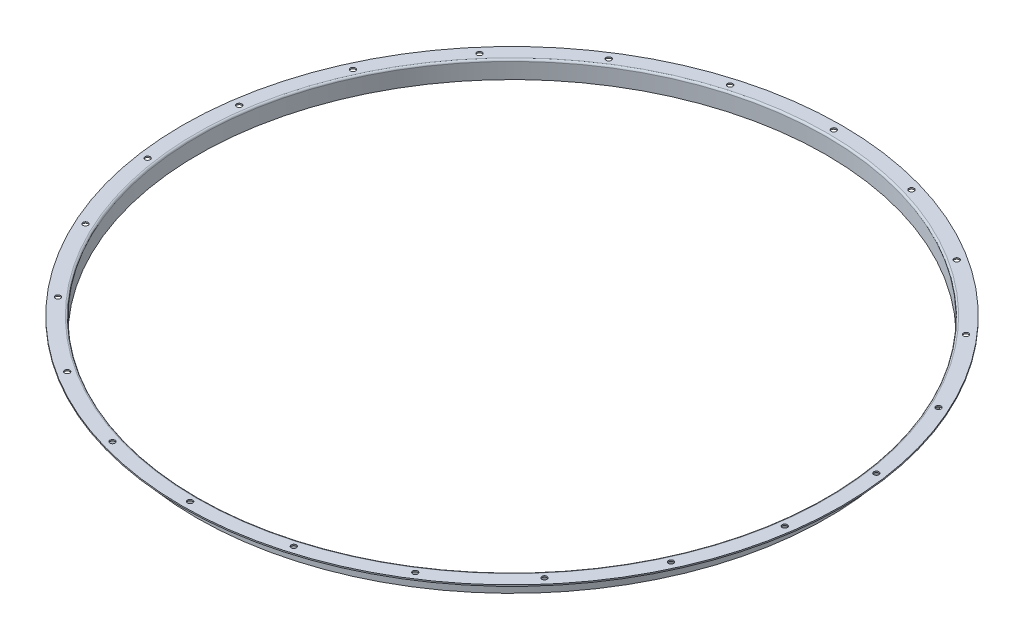
ISO-10303-21;
HEADER;
FILE_DESCRIPTION(('STEP AP214'),'2;1');
FILE_NAME('part.step','',(''),(''),'','','');
FILE_SCHEMA(('AUTOMOTIVE_DESIGN { 1 0 10303 214 1 1 1 1 }'));
ENDSEC;
DATA;
#1=APPLICATION_CONTEXT('core data for automotive mechanical design processes');
#2=APPLICATION_PROTOCOL_DEFINITION('international standard','automotive_design',2000,#1);
#3=PRODUCT_CONTEXT('',#1,'mechanical');
#4=PRODUCT('Part','Part','',(#3));
#5=PRODUCT_RELATED_PRODUCT_CATEGORY('part','',(#4));
#6=PRODUCT_DEFINITION_FORMATION('','',#4);
#7=PRODUCT_DEFINITION_CONTEXT('part definition',#1,'design');
#8=PRODUCT_DEFINITION('design','',#6,#7);
#9=PRODUCT_DEFINITION_SHAPE('','',#8);
#10=(LENGTH_UNIT() NAMED_UNIT(*) SI_UNIT(.MILLI.,.METRE.));
#11=(NAMED_UNIT(*) PLANE_ANGLE_UNIT() SI_UNIT($,.RADIAN.));
#12=(NAMED_UNIT(*) SI_UNIT($,.STERADIAN.) SOLID_ANGLE_UNIT());
#13=UNCERTAINTY_MEASURE_WITH_UNIT(LENGTH_MEASURE(1.E-05),#10,'distance_accuracy_value','');
#14=(GEOMETRIC_REPRESENTATION_CONTEXT(3) GLOBAL_UNCERTAINTY_ASSIGNED_CONTEXT((#13)) GLOBAL_UNIT_ASSIGNED_CONTEXT((#10,
#11,#12)) REPRESENTATION_CONTEXT('',''));
#15=CARTESIAN_POINT('',(0.,0.,0.));
#16=DIRECTION('',(0.,0.,1.));
#17=DIRECTION('',(1.,0.,0.));
#18=AXIS2_PLACEMENT_3D('',#15,#16,#17);
#19=CARTESIAN_POINT('',(0.,-2.5,0.));
#20=DIRECTION('',(0.,1.,0.));
#21=DIRECTION('',(0.,0.,1.));
#22=AXIS2_PLACEMENT_3D('',#19,#20,#21);
#23=PLANE('',#22);
#24=CARTESIAN_POINT('',(-559.423677142992,-2.5,255.480232996192));
#25=DIRECTION('',(0.,1.,0.));
#26=DIRECTION('',(0.,0.,1.));
#27=AXIS2_PLACEMENT_3D('',#24,#25,#26);
#28=CIRCLE('',#27,5.00000000006797);
#29=CARTESIAN_POINT('',(-559.423677142992,-2.5,260.48023299626));
#30=VERTEX_POINT('',#29);
#31=EDGE_CURVE('E139',#30,#30,#28,.T.);
#32=ORIENTED_EDGE('',*,*,#31,.T.);
#33=EDGE_LOOP('',(#32));
#34=FACE_BOUND('',#33,.T.);
#35=CARTESIAN_POINT('',(-464.785988227824,-2.5,402.739351376377));
#36=DIRECTION('',(0.,1.,0.));
#37=DIRECTION('',(0.,0.,1.));
#38=AXIS2_PLACEMENT_3D('',#35,#36,#37);
#39=CIRCLE('',#38,5.00000000006797);
#40=CARTESIAN_POINT('',(-464.785988227824,-2.5,407.739351376445));
#41=VERTEX_POINT('',#40);
#42=EDGE_CURVE('E335',#41,#41,#39,.T.);
#43=ORIENTED_EDGE('',*,*,#42,.T.);
#44=EDGE_LOOP('',(#43));
#45=FACE_BOUND('',#44,.T.);
#46=CARTESIAN_POINT('',(-332.494102735141,-2.5,517.370922691195));
#47=DIRECTION('',(0.,1.,0.));
#48=DIRECTION('',(0.,0.,1.));
#49=AXIS2_PLACEMENT_3D('',#46,#47,#48);
#50=CIRCLE('',#49,5.00000000006797);
#51=CARTESIAN_POINT('',(-332.494102735141,-2.5,522.370922691263));
#52=VERTEX_POINT('',#51);
#53=EDGE_CURVE('E333',#52,#52,#50,.T.);
#54=ORIENTED_EDGE('',*,*,#53,.T.);
#55=EDGE_LOOP('',(#54));
#56=FACE_BOUND('',#55,.T.);
#57=CARTESIAN_POINT('',(-173.265522457423,-2.5,590.088178772926));
#58=DIRECTION('',(0.,1.,0.));
#59=DIRECTION('',(0.,0.,1.));
#60=AXIS2_PLACEMENT_3D('',#57,#58,#59);
#61=CIRCLE('',#60,5.00000000006797);
#62=CARTESIAN_POINT('',(-173.265522457423,-2.5,595.088178772994));
#63=VERTEX_POINT('',#62);
#64=EDGE_CURVE('E330',#63,#63,#61,.T.);
#65=ORIENTED_EDGE('',*,*,#64,.T.);
#66=EDGE_LOOP('',(#65));
#67=FACE_BOUND('',#66,.T.);
#68=CARTESIAN_POINT('',(5.72449751156519E-11,-2.5,615.));
#69=DIRECTION('',(0.,1.,0.));
#70=DIRECTION('',(0.,0.,1.));
#71=AXIS2_PLACEMENT_3D('',#68,#69,#70);
#72=CIRCLE('',#71,5.00000000006795);
#73=CARTESIAN_POINT('',(5.72449751156519E-11,-2.5,620.000000000068));
#74=VERTEX_POINT('',#73);
#75=EDGE_CURVE('E327',#74,#74,#72,.T.);
#76=ORIENTED_EDGE('',*,*,#75,.T.);
#77=EDGE_LOOP('',(#76));
#78=FACE_BOUND('',#77,.T.);
#79=CARTESIAN_POINT('',(173.265522457535,-2.5,590.088178772906));
#80=DIRECTION('',(0.,1.,0.));
#81=DIRECTION('',(0.,0.,1.));
#82=AXIS2_PLACEMENT_3D('',#79,#80,#81);
#83=CIRCLE('',#82,5.00000000006797);
#84=CARTESIAN_POINT('',(173.265522457535,-2.5,595.088178772974));
#85=VERTEX_POINT('',#84);
#86=EDGE_CURVE('E324',#85,#85,#83,.T.);
#87=ORIENTED_EDGE('',*,*,#86,.T.);
#88=EDGE_LOOP('',(#87));
#89=FACE_BOUND('',#88,.T.);
#90=CARTESIAN_POINT('',(332.494102735244,-2.5,517.370922691157));
#91=DIRECTION('',(0.,1.,0.));
#92=DIRECTION('',(0.,0.,1.));
#93=AXIS2_PLACEMENT_3D('',#90,#91,#92);
#94=CIRCLE('',#93,5.00000000006797);
#95=CARTESIAN_POINT('',(332.494102735244,-2.5,522.370922691225));
#96=VERTEX_POINT('',#95);
#97=EDGE_CURVE('E321',#96,#96,#94,.T.);
#98=ORIENTED_EDGE('',*,*,#97,.T.);
#99=EDGE_LOOP('',(#98));
#100=FACE_BOUND('',#99,.T.);
#101=CARTESIAN_POINT('',(464.785988227914,-2.5,402.739351376324));
#102=DIRECTION('',(0.,1.,0.));
#103=DIRECTION('',(0.,0.,1.));
#104=AXIS2_PLACEMENT_3D('',#101,#102,#103);
#105=CIRCLE('',#104,5.00000000006797);
#106=CARTESIAN_POINT('',(464.785988227914,-2.5,407.739351376392));
#107=VERTEX_POINT('',#106);
#108=EDGE_CURVE('E318',#107,#107,#105,.T.);
#109=ORIENTED_EDGE('',*,*,#108,.T.);
#110=EDGE_LOOP('',(#109));
#111=FACE_BOUND('',#110,.T.);
#112=CARTESIAN_POINT('',(559.423677143066,-2.5,255.480232996128));
#113=DIRECTION('',(0.,1.,0.));
#114=DIRECTION('',(0.,0.,1.));
#115=AXIS2_PLACEMENT_3D('',#112,#113,#114);
#116=CIRCLE('',#115,5.00000000006797);
#117=CARTESIAN_POINT('',(559.423677143066,-2.5,260.480232996196));
#118=VERTEX_POINT('',#117);
#119=EDGE_CURVE('E315',#118,#118,#116,.T.);
#120=ORIENTED_EDGE('',*,*,#119,.T.);
#121=EDGE_LOOP('',(#120));
#122=FACE_BOUND('',#121,.T.);
#123=CARTESIAN_POINT('',(608.740186756801,-2.5,87.5236255380358));
#124=DIRECTION('',(0.,1.,0.));
#125=DIRECTION('',(0.,0.,1.));
#126=AXIS2_PLACEMENT_3D('',#123,#124,#125);
#127=CIRCLE('',#126,5.00000000006796);
#128=CARTESIAN_POINT('',(608.740186756801,-2.5,92.5236255381038));
#129=VERTEX_POINT('',#128);
#130=EDGE_CURVE('E312',#129,#129,#127,.T.);
#131=ORIENTED_EDGE('',*,*,#130,.T.);
#132=EDGE_LOOP('',(#131));
#133=FACE_BOUND('',#132,.T.);
#134=CARTESIAN_POINT('',(608.740186756791,-2.5,-87.5236255381049));
#135=DIRECTION('',(0.,1.,0.));
#136=DIRECTION('',(0.,0.,1.));
#137=AXIS2_PLACEMENT_3D('',#134,#135,#136);
#138=CIRCLE('',#137,5.00000000006796);
#139=CARTESIAN_POINT('',(608.740186756791,-2.5,-82.5236255380369));
#140=VERTEX_POINT('',#139);
#141=EDGE_CURVE('E309',#140,#140,#138,.T.);
#142=ORIENTED_EDGE('',*,*,#141,.T.);
#143=EDGE_LOOP('',(#142));
#144=FACE_BOUND('',#143,.T.);
#145=CARTESIAN_POINT('',(559.423677143037,-2.5,-255.480232996192));
#146=DIRECTION('',(0.,1.,0.));
#147=DIRECTION('',(0.,0.,1.));
#148=AXIS2_PLACEMENT_3D('',#145,#146,#147);
#149=CIRCLE('',#148,5.00000000006797);
#150=CARTESIAN_POINT('',(559.423677143037,-2.5,-250.480232996124));
#151=VERTEX_POINT('',#150);
#152=EDGE_CURVE('E306',#151,#151,#149,.T.);
#153=ORIENTED_EDGE('',*,*,#152,.T.);
#154=EDGE_LOOP('',(#153));
#155=FACE_BOUND('',#154,.T.);
#156=CARTESIAN_POINT('',(173.265522457468,-2.5,-590.088178772926));
#157=DIRECTION('',(0.,1.,0.));
#158=DIRECTION('',(0.,0.,1.));
#159=AXIS2_PLACEMENT_3D('',#156,#157,#158);
#160=CIRCLE('',#159,5.00000000006797);
#161=CARTESIAN_POINT('',(173.265522457468,-2.5,-585.088178772858));
#162=VERTEX_POINT('',#161);
#163=EDGE_CURVE('E303',#162,#162,#160,.T.);
#164=ORIENTED_EDGE('',*,*,#163,.T.);
#165=EDGE_LOOP('',(#164));
#166=FACE_BOUND('',#165,.T.);
#167=CARTESIAN_POINT('',(332.494102735185,-2.5,-517.370922691195));
#168=DIRECTION('',(0.,1.,0.));
#169=DIRECTION('',(0.,0.,1.));
#170=AXIS2_PLACEMENT_3D('',#167,#168,#169);
#171=CIRCLE('',#170,5.00000000006797);
#172=CARTESIAN_POINT('',(332.494102735185,-2.5,-512.370922691127));
#173=VERTEX_POINT('',#172);
#174=EDGE_CURVE('E300',#173,#173,#171,.T.);
#175=ORIENTED_EDGE('',*,*,#174,.T.);
#176=EDGE_LOOP('',(#175));
#177=FACE_BOUND('',#176,.T.);
#178=CARTESIAN_POINT('',(-1.25217985268468E-11,-2.5,-615.));
#179=DIRECTION('',(0.,1.,0.));
#180=DIRECTION('',(0.,0.,1.));
#181=AXIS2_PLACEMENT_3D('',#178,#179,#180);
#182=CIRCLE('',#181,5.00000000006795);
#183=CARTESIAN_POINT('',(-1.25217985268468E-11,-2.5,-609.999999999932));
#184=VERTEX_POINT('',#183);
#185=EDGE_CURVE('E291',#184,#184,#182,.T.);
#186=ORIENTED_EDGE('',*,*,#185,.T.);
#187=EDGE_LOOP('',(#186));
#188=FACE_BOUND('',#187,.T.);
#189=CARTESIAN_POINT('',(464.785988227868,-2.5,-402.739351376377));
#190=DIRECTION('',(0.,1.,0.));
#191=DIRECTION('',(0.,0.,1.));
#192=AXIS2_PLACEMENT_3D('',#189,#190,#191);
#193=CIRCLE('',#192,5.00000000006797);
#194=CARTESIAN_POINT('',(464.785988227868,-2.5,-397.739351376309));
#195=VERTEX_POINT('',#194);
#196=EDGE_CURVE('E287',#195,#195,#193,.T.);
#197=ORIENTED_EDGE('',*,*,#196,.T.);
#198=EDGE_LOOP('',(#197));
#199=FACE_BOUND('',#198,.T.);
#200=CARTESIAN_POINT('',(-608.740186756756,-2.5,-87.5236255380357));
#201=DIRECTION('',(0.,1.,0.));
#202=DIRECTION('',(0.,0.,1.));
#203=AXIS2_PLACEMENT_3D('',#200,#201,#202);
#204=CIRCLE('',#203,5.00000000006843);
#205=CARTESIAN_POINT('',(-608.740186756756,-2.5,-82.5236255379673));
#206=VERTEX_POINT('',#205);
#207=EDGE_CURVE('E285',#206,#206,#204,.T.);
#208=ORIENTED_EDGE('',*,*,#207,.T.);
#209=EDGE_LOOP('',(#208));
#210=FACE_BOUND('',#209,.T.);
#211=CARTESIAN_POINT('',(-559.423677143021,-2.5,-255.480232996128));
#212=DIRECTION('',(0.,1.,0.));
#213=DIRECTION('',(0.,0.,1.));
#214=AXIS2_PLACEMENT_3D('',#211,#212,#213);
#215=CIRCLE('',#214,5.00000000007028);
#216=CARTESIAN_POINT('',(-559.423677143021,-2.5,-250.480232996058));
#217=VERTEX_POINT('',#216);
#218=EDGE_CURVE('E288',#217,#217,#215,.T.);
#219=ORIENTED_EDGE('',*,*,#218,.T.);
#220=EDGE_LOOP('',(#219));
#221=FACE_BOUND('',#220,.T.);
#222=CARTESIAN_POINT('',(-464.785988227869,-2.5,-402.739351376324));
#223=DIRECTION('',(0.,1.,0.));
#224=DIRECTION('',(0.,0.,1.));
#225=AXIS2_PLACEMENT_3D('',#222,#223,#224);
#226=CIRCLE('',#225,5.00000000006797);
#227=CARTESIAN_POINT('',(-464.785988227869,-2.5,-397.739351376256));
#228=VERTEX_POINT('',#227);
#229=EDGE_CURVE('E294',#228,#228,#226,.T.);
#230=ORIENTED_EDGE('',*,*,#229,.T.);
#231=EDGE_LOOP('',(#230));
#232=FACE_BOUND('',#231,.T.);
#233=CARTESIAN_POINT('',(-332.494102735199,-2.5,-517.370922691158));
#234=DIRECTION('',(0.,1.,0.));
#235=DIRECTION('',(0.,0.,1.));
#236=AXIS2_PLACEMENT_3D('',#233,#234,#235);
#237=CIRCLE('',#236,5.00000000006797);
#238=CARTESIAN_POINT('',(-332.494102735199,-2.5,-512.37092269109));
#239=VERTEX_POINT('',#238);
#240=EDGE_CURVE('E378',#239,#239,#237,.T.);
#241=ORIENTED_EDGE('',*,*,#240,.T.);
#242=EDGE_LOOP('',(#241));
#243=FACE_BOUND('',#242,.T.);
#244=CARTESIAN_POINT('',(-173.26552245749,-2.5,-590.088178772906));
#245=DIRECTION('',(0.,1.,0.));
#246=DIRECTION('',(0.,0.,1.));
#247=AXIS2_PLACEMENT_3D('',#244,#245,#246);
#248=CIRCLE('',#247,5.00000000006797);
#249=CARTESIAN_POINT('',(-173.26552245749,-2.5,-585.088178772838));
#250=VERTEX_POINT('',#249);
#251=EDGE_CURVE('E382',#250,#250,#248,.T.);
#252=ORIENTED_EDGE('',*,*,#251,.T.);
#253=EDGE_LOOP('',(#252));
#254=FACE_BOUND('',#253,.T.);
#255=CARTESIAN_POINT('',(-608.740186756746,-2.5,87.5236255381049));
#256=DIRECTION('',(0.,1.,0.));
#257=DIRECTION('',(0.,0.,1.));
#258=AXIS2_PLACEMENT_3D('',#255,#256,#257);
#259=CIRCLE('',#258,5.00000000006796);
#260=CARTESIAN_POINT('',(-608.740186756746,-2.5,92.5236255381729));
#261=VERTEX_POINT('',#260);
#262=EDGE_CURVE('E386',#261,#261,#259,.T.);
#263=ORIENTED_EDGE('',*,*,#262,.T.);
#264=EDGE_LOOP('',(#263));
#265=FACE_BOUND('',#264,.T.);
#266=CARTESIAN_POINT('',(0.,-2.5,0.));
#267=DIRECTION('',(0.,1.,0.));
#268=DIRECTION('',(0.,0.,1.));
#269=AXIS2_PLACEMENT_3D('',#266,#267,#268);
#270=CIRCLE('',#269,630.);
#271=CARTESIAN_POINT('',(0.,-2.5,630.));
#272=VERTEX_POINT('',#271);
#273=EDGE_CURVE('E96',#272,#272,#270,.T.);
#274=ORIENTED_EDGE('',*,*,#273,.F.);
#275=EDGE_LOOP('',(#274));
#276=FACE_BOUND('',#275,.T.);
#277=CARTESIAN_POINT('',(0.,-2.5,0.));
#278=DIRECTION('',(0.,1.,0.));
#279=DIRECTION('',(0.,0.,1.));
#280=AXIS2_PLACEMENT_3D('',#277,#278,#279);
#281=CIRCLE('',#280,603.5);
#282=CARTESIAN_POINT('',(0.,-2.5,603.5));
#283=VERTEX_POINT('',#282);
#284=EDGE_CURVE('E12',#283,#283,#281,.F.);
#285=ORIENTED_EDGE('',*,*,#284,.F.);
#286=EDGE_LOOP('',(#285));
#287=FACE_BOUND('',#286,.T.);
#288=ADVANCED_FACE('F88',(#34,#45,#56,#67,#78,#89,#100,#111,#122,#133,#144,#155,#166,#177,#188,
#199,#210,#221,#232,#243,#254,#265,#276,#287),#23,.F.);
#289=CARTESIAN_POINT('',(0.,0.,0.));
#290=DIRECTION('',(0.,1.,0.));
#291=DIRECTION('',(0.,0.,1.));
#292=AXIS2_PLACEMENT_3D('',#289,#290,#291);
#293=PLANE('',#292);
#294=CARTESIAN_POINT('',(-559.423677142992,0.,255.480232996192));
#295=DIRECTION('',(0.,1.,0.));
#296=DIRECTION('',(0.,0.,1.));
#297=AXIS2_PLACEMENT_3D('',#294,#295,#296);
#298=CIRCLE('',#297,5.00000000006797);
#299=CARTESIAN_POINT('',(-559.423677142992,0.,260.48023299626));
#300=VERTEX_POINT('',#299);
#301=EDGE_CURVE('E421',#300,#300,#298,.T.);
#302=ORIENTED_EDGE('',*,*,#301,.F.);
#303=EDGE_LOOP('',(#302));
#304=FACE_BOUND('',#303,.T.);
#305=CARTESIAN_POINT('',(-464.785988227824,0.,402.739351376377));
#306=DIRECTION('',(0.,1.,0.));
#307=DIRECTION('',(0.,0.,1.));
#308=AXIS2_PLACEMENT_3D('',#305,#306,#307);
#309=CIRCLE('',#308,5.00000000006797);
#310=CARTESIAN_POINT('',(-464.785988227824,0.,407.739351376445));
#311=VERTEX_POINT('',#310);
#312=EDGE_CURVE('E424',#311,#311,#309,.T.);
#313=ORIENTED_EDGE('',*,*,#312,.F.);
#314=EDGE_LOOP('',(#313));
#315=FACE_BOUND('',#314,.T.);
#316=CARTESIAN_POINT('',(-332.494102735141,0.,517.370922691195));
#317=DIRECTION('',(0.,1.,0.));
#318=DIRECTION('',(0.,0.,1.));
#319=AXIS2_PLACEMENT_3D('',#316,#317,#318);
#320=CIRCLE('',#319,5.00000000006797);
#321=CARTESIAN_POINT('',(-332.494102735141,0.,522.370922691263));
#322=VERTEX_POINT('',#321);
#323=EDGE_CURVE('E427',#322,#322,#320,.T.);
#324=ORIENTED_EDGE('',*,*,#323,.F.);
#325=EDGE_LOOP('',(#324));
#326=FACE_BOUND('',#325,.T.);
#327=CARTESIAN_POINT('',(-173.265522457423,0.,590.088178772926));
#328=DIRECTION('',(0.,1.,0.));
#329=DIRECTION('',(0.,0.,1.));
#330=AXIS2_PLACEMENT_3D('',#327,#328,#329);
#331=CIRCLE('',#330,5.00000000006797);
#332=CARTESIAN_POINT('',(-173.265522457423,0.,595.088178772994));
#333=VERTEX_POINT('',#332);
#334=EDGE_CURVE('E430',#333,#333,#331,.T.);
#335=ORIENTED_EDGE('',*,*,#334,.F.);
#336=EDGE_LOOP('',(#335));
#337=FACE_BOUND('',#336,.T.);
#338=CARTESIAN_POINT('',(5.72449751156519E-11,0.,615.));
#339=DIRECTION('',(0.,1.,0.));
#340=DIRECTION('',(0.,0.,1.));
#341=AXIS2_PLACEMENT_3D('',#338,#339,#340);
#342=CIRCLE('',#341,5.00000000006795);
#343=CARTESIAN_POINT('',(5.72449751156519E-11,0.,620.000000000068));
#344=VERTEX_POINT('',#343);
#345=EDGE_CURVE('E433',#344,#344,#342,.T.);
#346=ORIENTED_EDGE('',*,*,#345,.F.);
#347=EDGE_LOOP('',(#346));
#348=FACE_BOUND('',#347,.T.);
#349=CARTESIAN_POINT('',(173.265522457535,0.,590.088178772906));
#350=DIRECTION('',(0.,1.,0.));
#351=DIRECTION('',(0.,0.,1.));
#352=AXIS2_PLACEMENT_3D('',#349,#350,#351);
#353=CIRCLE('',#352,5.00000000006797);
#354=CARTESIAN_POINT('',(173.265522457535,0.,595.088178772974));
#355=VERTEX_POINT('',#354);
#356=EDGE_CURVE('E436',#355,#355,#353,.T.);
#357=ORIENTED_EDGE('',*,*,#356,.F.);
#358=EDGE_LOOP('',(#357));
#359=FACE_BOUND('',#358,.T.);
#360=CARTESIAN_POINT('',(332.494102735244,0.,517.370922691157));
#361=DIRECTION('',(0.,1.,0.));
#362=DIRECTION('',(0.,0.,1.));
#363=AXIS2_PLACEMENT_3D('',#360,#361,#362);
#364=CIRCLE('',#363,5.00000000006797);
#365=CARTESIAN_POINT('',(332.494102735244,0.,522.370922691225));
#366=VERTEX_POINT('',#365);
#367=EDGE_CURVE('E439',#366,#366,#364,.T.);
#368=ORIENTED_EDGE('',*,*,#367,.F.);
#369=EDGE_LOOP('',(#368));
#370=FACE_BOUND('',#369,.T.);
#371=CARTESIAN_POINT('',(464.785988227914,0.,402.739351376324));
#372=DIRECTION('',(0.,1.,0.));
#373=DIRECTION('',(0.,0.,1.));
#374=AXIS2_PLACEMENT_3D('',#371,#372,#373);
#375=CIRCLE('',#374,5.00000000006797);
#376=CARTESIAN_POINT('',(464.785988227914,0.,407.739351376392));
#377=VERTEX_POINT('',#376);
#378=EDGE_CURVE('E401',#377,#377,#375,.T.);
#379=ORIENTED_EDGE('',*,*,#378,.F.);
#380=EDGE_LOOP('',(#379));
#381=FACE_BOUND('',#380,.T.);
#382=CARTESIAN_POINT('',(559.423677143066,0.,255.480232996128));
#383=DIRECTION('',(0.,1.,0.));
#384=DIRECTION('',(0.,0.,1.));
#385=AXIS2_PLACEMENT_3D('',#382,#383,#384);
#386=CIRCLE('',#385,5.00000000006797);
#387=CARTESIAN_POINT('',(559.423677143066,0.,260.480232996196));
#388=VERTEX_POINT('',#387);
#389=EDGE_CURVE('E397',#388,#388,#386,.T.);
#390=ORIENTED_EDGE('',*,*,#389,.F.);
#391=EDGE_LOOP('',(#390));
#392=FACE_BOUND('',#391,.T.);
#393=CARTESIAN_POINT('',(608.740186756801,0.,87.5236255380358));
#394=DIRECTION('',(0.,1.,0.));
#395=DIRECTION('',(0.,0.,1.));
#396=AXIS2_PLACEMENT_3D('',#393,#394,#395);
#397=CIRCLE('',#396,5.00000000006796);
#398=CARTESIAN_POINT('',(608.740186756801,0.,92.5236255381038));
#399=VERTEX_POINT('',#398);
#400=EDGE_CURVE('E400',#399,#399,#397,.T.);
#401=ORIENTED_EDGE('',*,*,#400,.F.);
#402=EDGE_LOOP('',(#401));
#403=FACE_BOUND('',#402,.T.);
#404=CARTESIAN_POINT('',(608.740186756791,0.,-87.5236255381049));
#405=DIRECTION('',(0.,1.,0.));
#406=DIRECTION('',(0.,0.,1.));
#407=AXIS2_PLACEMENT_3D('',#404,#405,#406);
#408=CIRCLE('',#407,5.00000000006796);
#409=CARTESIAN_POINT('',(608.740186756791,0.,-82.5236255380369));
#410=VERTEX_POINT('',#409);
#411=EDGE_CURVE('E404',#410,#410,#408,.T.);
#412=ORIENTED_EDGE('',*,*,#411,.F.);
#413=EDGE_LOOP('',(#412));
#414=FACE_BOUND('',#413,.T.);
#415=CARTESIAN_POINT('',(559.423677143037,0.,-255.480232996192));
#416=DIRECTION('',(0.,1.,0.));
#417=DIRECTION('',(0.,0.,1.));
#418=AXIS2_PLACEMENT_3D('',#415,#416,#417);
#419=CIRCLE('',#418,5.00000000006797);
#420=CARTESIAN_POINT('',(559.423677143037,0.,-250.480232996124));
#421=VERTEX_POINT('',#420);
#422=EDGE_CURVE('E407',#421,#421,#419,.T.);
#423=ORIENTED_EDGE('',*,*,#422,.F.);
#424=EDGE_LOOP('',(#423));
#425=FACE_BOUND('',#424,.T.);
#426=CARTESIAN_POINT('',(173.265522457468,0.,-590.088178772926));
#427=DIRECTION('',(0.,1.,0.));
#428=DIRECTION('',(0.,0.,1.));
#429=AXIS2_PLACEMENT_3D('',#426,#427,#428);
#430=CIRCLE('',#429,5.00000000006797);
#431=CARTESIAN_POINT('',(173.265522457468,0.,-585.088178772858));
#432=VERTEX_POINT('',#431);
#433=EDGE_CURVE('E393',#432,#432,#430,.T.);
#434=ORIENTED_EDGE('',*,*,#433,.F.);
#435=EDGE_LOOP('',(#434));
#436=FACE_BOUND('',#435,.T.);
#437=CARTESIAN_POINT('',(332.494102735185,0.,-517.370922691195));
#438=DIRECTION('',(0.,1.,0.));
#439=DIRECTION('',(0.,0.,1.));
#440=AXIS2_PLACEMENT_3D('',#437,#438,#439);
#441=CIRCLE('',#440,5.00000000006797);
#442=CARTESIAN_POINT('',(332.494102735185,0.,-512.370922691127));
#443=VERTEX_POINT('',#442);
#444=EDGE_CURVE('E411',#443,#443,#441,.T.);
#445=ORIENTED_EDGE('',*,*,#444,.F.);
#446=EDGE_LOOP('',(#445));
#447=FACE_BOUND('',#446,.T.);
#448=CARTESIAN_POINT('',(-1.25217985268468E-11,0.,-615.));
#449=DIRECTION('',(0.,1.,0.));
#450=DIRECTION('',(0.,0.,1.));
#451=AXIS2_PLACEMENT_3D('',#448,#449,#450);
#452=CIRCLE('',#451,5.00000000006795);
#453=CARTESIAN_POINT('',(-1.25217985268468E-11,0.,-609.999999999932));
#454=VERTEX_POINT('',#453);
#455=EDGE_CURVE('E414',#454,#454,#452,.T.);
#456=ORIENTED_EDGE('',*,*,#455,.F.);
#457=EDGE_LOOP('',(#456));
#458=FACE_BOUND('',#457,.T.);
#459=CARTESIAN_POINT('',(464.785988227868,0.,-402.739351376377));
#460=DIRECTION('',(0.,1.,0.));
#461=DIRECTION('',(0.,0.,1.));
#462=AXIS2_PLACEMENT_3D('',#459,#460,#461);
#463=CIRCLE('',#462,5.00000000006797);
#464=CARTESIAN_POINT('',(464.785988227868,0.,-397.739351376309));
#465=VERTEX_POINT('',#464);
#466=EDGE_CURVE('E410',#465,#465,#463,.T.);
#467=ORIENTED_EDGE('',*,*,#466,.F.);
#468=EDGE_LOOP('',(#467));
#469=FACE_BOUND('',#468,.T.);
#470=CARTESIAN_POINT('',(-608.740186756756,0.,-87.5236255380357));
#471=DIRECTION('',(0.,1.,0.));
#472=DIRECTION('',(0.,0.,1.));
#473=AXIS2_PLACEMENT_3D('',#470,#471,#472);
#474=CIRCLE('',#473,5.00000000006843);
#475=CARTESIAN_POINT('',(-608.740186756756,0.,-82.5236255379673));
#476=VERTEX_POINT('',#475);
#477=EDGE_CURVE('E282',#476,#476,#474,.T.);
#478=ORIENTED_EDGE('',*,*,#477,.F.);
#479=EDGE_LOOP('',(#478));
#480=FACE_BOUND('',#479,.T.);
#481=CARTESIAN_POINT('',(-559.423677143021,0.,-255.480232996128));
#482=DIRECTION('',(0.,1.,0.));
#483=DIRECTION('',(0.,0.,1.));
#484=AXIS2_PLACEMENT_3D('',#481,#482,#483);
#485=CIRCLE('',#484,5.00000000007028);
#486=CARTESIAN_POINT('',(-559.423677143021,0.,-250.480232996058));
#487=VERTEX_POINT('',#486);
#488=EDGE_CURVE('E453',#487,#487,#485,.T.);
#489=ORIENTED_EDGE('',*,*,#488,.F.);
#490=EDGE_LOOP('',(#489));
#491=FACE_BOUND('',#490,.T.);
#492=CARTESIAN_POINT('',(-464.785988227869,0.,-402.739351376324));
#493=DIRECTION('',(0.,1.,0.));
#494=DIRECTION('',(0.,0.,1.));
#495=AXIS2_PLACEMENT_3D('',#492,#493,#494);
#496=CIRCLE('',#495,5.00000000006797);
#497=CARTESIAN_POINT('',(-464.785988227869,0.,-397.739351376256));
#498=VERTEX_POINT('',#497);
#499=EDGE_CURVE('E450',#498,#498,#496,.T.);
#500=ORIENTED_EDGE('',*,*,#499,.F.);
#501=EDGE_LOOP('',(#500));
#502=FACE_BOUND('',#501,.T.);
#503=CARTESIAN_POINT('',(-332.494102735199,0.,-517.370922691158));
#504=DIRECTION('',(0.,1.,0.));
#505=DIRECTION('',(0.,0.,1.));
#506=AXIS2_PLACEMENT_3D('',#503,#504,#505);
#507=CIRCLE('',#506,5.00000000006797);
#508=CARTESIAN_POINT('',(-332.494102735199,0.,-512.37092269109));
#509=VERTEX_POINT('',#508);
#510=EDGE_CURVE('E447',#509,#509,#507,.T.);
#511=ORIENTED_EDGE('',*,*,#510,.F.);
#512=EDGE_LOOP('',(#511));
#513=FACE_BOUND('',#512,.T.);
#514=CARTESIAN_POINT('',(-173.26552245749,0.,-590.088178772906));
#515=DIRECTION('',(0.,1.,0.));
#516=DIRECTION('',(0.,0.,1.));
#517=AXIS2_PLACEMENT_3D('',#514,#515,#516);
#518=CIRCLE('',#517,5.00000000006797);
#519=CARTESIAN_POINT('',(-173.26552245749,0.,-585.088178772838));
#520=VERTEX_POINT('',#519);
#521=EDGE_CURVE('E444',#520,#520,#518,.T.);
#522=ORIENTED_EDGE('',*,*,#521,.F.);
#523=EDGE_LOOP('',(#522));
#524=FACE_BOUND('',#523,.T.);
#525=CARTESIAN_POINT('',(-608.740186756746,0.,87.5236255381049));
#526=DIRECTION('',(0.,1.,0.));
#527=DIRECTION('',(0.,0.,1.));
#528=AXIS2_PLACEMENT_3D('',#525,#526,#527);
#529=CIRCLE('',#528,5.00000000006796);
#530=CARTESIAN_POINT('',(-608.740186756746,0.,92.5236255381729));
#531=VERTEX_POINT('',#530);
#532=EDGE_CURVE('E389',#531,#531,#529,.T.);
#533=ORIENTED_EDGE('',*,*,#532,.F.);
#534=EDGE_LOOP('',(#533));
#535=FACE_BOUND('',#534,.T.);
#536=CARTESIAN_POINT('',(0.,0.,0.));
#537=DIRECTION('',(0.,1.,0.));
#538=DIRECTION('',(0.,0.,1.));
#539=AXIS2_PLACEMENT_3D('',#536,#537,#538);
#540=CIRCLE('',#539,630.);
#541=CARTESIAN_POINT('',(0.,0.,630.));
#542=VERTEX_POINT('',#541);
#543=EDGE_CURVE('E152',#542,#542,#540,.T.);
#544=ORIENTED_EDGE('',*,*,#543,.T.);
#545=EDGE_LOOP('',(#544));
#546=FACE_BOUND('',#545,.T.);
#547=CARTESIAN_POINT('',(0.,0.,0.));
#548=DIRECTION('',(0.,1.,0.));
#549=DIRECTION('',(0.,0.,1.));
#550=AXIS2_PLACEMENT_3D('',#547,#548,#549);
#551=CIRCLE('',#550,603.5);
#552=CARTESIAN_POINT('',(0.,0.,603.5));
#553=VERTEX_POINT('',#552);
#554=EDGE_CURVE('E103',#553,#553,#551,.T.);
#555=ORIENTED_EDGE('',*,*,#554,.F.);
#556=EDGE_LOOP('',(#555));
#557=FACE_BOUND('',#556,.T.);
#558=ADVANCED_FACE('F157',(#304,#315,#326,#337,#348,#359,#370,#381,#392,#403,#414,#425,#436,
#447,#458,#469,#480,#491,#502,#513,#524,#535,#546,#557),#293,.T.);
#559=CARTESIAN_POINT('',(0.,-2.5,0.));
#560=DIRECTION('',(0.,1.,0.));
#561=DIRECTION('',(0.,0.,1.));
#562=AXIS2_PLACEMENT_3D('',#559,#560,#561);
#563=CYLINDRICAL_SURFACE('',#562,630.);
#564=ORIENTED_EDGE('',*,*,#273,.T.);
#565=EDGE_LOOP('',(#564));
#566=FACE_BOUND('',#565,.T.);
#567=ORIENTED_EDGE('',*,*,#543,.F.);
#568=EDGE_LOOP('',(#567));
#569=FACE_BOUND('',#568,.T.);
#570=ADVANCED_FACE('F90',(#566,#569),#563,.T.);
#571=CARTESIAN_POINT('',(0.,-33.4999999999998,0.));
#572=DIRECTION('',(0.,-1.,0.));
#573=DIRECTION('',(0.,0.,-1.));
#574=AXIS2_PLACEMENT_3D('',#571,#572,#573);
#575=PLANE('',#574);
#576=CARTESIAN_POINT('',(0.,-33.4999999999998,0.));
#577=DIRECTION('',(0.,1.,0.));
#578=DIRECTION('',(0.,0.,1.));
#579=AXIS2_PLACEMENT_3D('',#576,#577,#578);
#580=CIRCLE('',#579,600.);
#581=CARTESIAN_POINT('',(0.,-33.4999999999998,600.));
#582=VERTEX_POINT('',#581);
#583=EDGE_CURVE('E131',#582,#582,#580,.T.);
#584=ORIENTED_EDGE('',*,*,#583,.T.);
#585=EDGE_LOOP('',(#584));
#586=FACE_BOUND('',#585,.T.);
#587=CARTESIAN_POINT('',(0.,-33.4999999999998,0.));
#588=DIRECTION('',(0.,1.,0.));
#589=DIRECTION('',(0.,0.,1.));
#590=AXIS2_PLACEMENT_3D('',#587,#588,#589);
#591=CIRCLE('',#590,602.5);
#592=CARTESIAN_POINT('',(0.,-33.4999999999998,602.5));
#593=VERTEX_POINT('',#592);
#594=EDGE_CURVE('E141',#593,#593,#591,.T.);
#595=ORIENTED_EDGE('',*,*,#594,.F.);
#596=EDGE_LOOP('',(#595));
#597=FACE_BOUND('',#596,.T.);
#598=ADVANCED_FACE('F161',(#586,#597),#575,.T.);
#599=CARTESIAN_POINT('',(0.,-2.5,0.));
#600=DIRECTION('',(0.,1.,0.));
#601=DIRECTION('',(0.,0.,1.));
#602=AXIS2_PLACEMENT_3D('',#599,#600,#601);
#603=CYLINDRICAL_SURFACE('',#602,602.5);
#604=DIRECTION('',(0.,-1.,0.));
#605=VECTOR('',#604,1.);
#606=CARTESIAN_POINT('',(0.,-2.5,602.5));
#607=LINE('',#606,#605);
#608=CARTESIAN_POINT('',(0.,-3.5,602.5));
#609=VERTEX_POINT('',#608);
#610=EDGE_CURVE('E130',#609,#593,#607,.T.);
#611=ORIENTED_EDGE('',*,*,#610,.F.);
#612=CARTESIAN_POINT('',(0.,-3.5,0.));
#613=DIRECTION('',(0.,1.,0.));
#614=DIRECTION('',(0.,0.,1.));
#615=AXIS2_PLACEMENT_3D('',#612,#613,#614);
#616=CIRCLE('',#615,602.5);
#617=EDGE_CURVE('E129',#609,#609,#616,.T.);
#618=ORIENTED_EDGE('',*,*,#617,.F.);
#619=ORIENTED_EDGE('',*,*,#610,.T.);
#620=ORIENTED_EDGE('',*,*,#594,.T.);
#621=EDGE_LOOP('',(#611,#618,#619,#620));
#622=FACE_BOUND('',#621,.T.);
#623=ADVANCED_FACE('F167',(#622),#603,.T.);
#624=CARTESIAN_POINT('',(0.,-3.5,0.));
#625=DIRECTION('',(0.,1.,0.));
#626=DIRECTION('',(0.,0.,1.));
#627=AXIS2_PLACEMENT_3D('',#624,#625,#626);
#628=TOROIDAL_SURFACE('',#627,603.5,1.);
#629=CARTESIAN_POINT('',(0.,-3.5,603.5));
#630=DIRECTION('',(1.,0.,0.));
#631=DIRECTION('',(0.,1.,0.));
#632=AXIS2_PLACEMENT_3D('',#629,#630,#631);
#633=CIRCLE('',#632,1.);
#634=EDGE_CURVE('E127',#283,#609,#633,.F.);
#635=ORIENTED_EDGE('',*,*,#634,.F.);
#636=ORIENTED_EDGE('',*,*,#284,.T.);
#637=ORIENTED_EDGE('',*,*,#634,.T.);
#638=ORIENTED_EDGE('',*,*,#617,.T.);
#639=EDGE_LOOP('',(#635,#636,#637,#638));
#640=FACE_BOUND('',#639,.T.);
#641=ADVANCED_FACE('F126',(#640),#628,.F.);
#642=CARTESIAN_POINT('',(0.,-2.5,0.));
#643=DIRECTION('',(0.,1.,0.));
#644=DIRECTION('',(0.,0.,1.));
#645=AXIS2_PLACEMENT_3D('',#642,#643,#644);
#646=CYLINDRICAL_SURFACE('',#645,600.);
#647=DIRECTION('',(0.,1.,0.));
#648=VECTOR('',#647,1.);
#649=CARTESIAN_POINT('',(0.,-2.5,600.));
#650=LINE('',#649,#648);
#651=CARTESIAN_POINT('',(0.,-3.50000000000001,600.));
#652=VERTEX_POINT('',#651);
#653=EDGE_CURVE('E144',#652,#582,#650,.F.);
#654=ORIENTED_EDGE('',*,*,#653,.T.);
#655=ORIENTED_EDGE('',*,*,#583,.F.);
#656=ORIENTED_EDGE('',*,*,#653,.F.);
#657=CARTESIAN_POINT('',(0.,-3.50000000000001,0.));
#658=DIRECTION('',(0.,1.,0.));
#659=DIRECTION('',(0.,0.,1.));
#660=AXIS2_PLACEMENT_3D('',#657,#658,#659);
#661=CIRCLE('',#660,600.);
#662=EDGE_CURVE('E135',#652,#652,#661,.T.);
#663=ORIENTED_EDGE('',*,*,#662,.T.);
#664=EDGE_LOOP('',(#654,#655,#656,#663));
#665=FACE_BOUND('',#664,.T.);
#666=ADVANCED_FACE('F182',(#665),#646,.F.);
#667=CARTESIAN_POINT('',(0.,-3.5,0.));
#668=DIRECTION('',(0.,1.,0.));
#669=DIRECTION('',(0.,0.,1.));
#670=AXIS2_PLACEMENT_3D('',#667,#668,#669);
#671=TOROIDAL_SURFACE('',#670,603.5,3.5);
#672=CARTESIAN_POINT('',(0.,-3.5,603.5));
#673=DIRECTION('',(-1.,0.,0.));
#674=DIRECTION('',(0.,0.,1.));
#675=AXIS2_PLACEMENT_3D('',#672,#673,#674);
#676=CIRCLE('',#675,3.5);
#677=EDGE_CURVE('E146',#553,#652,#676,.T.);
#678=ORIENTED_EDGE('',*,*,#677,.T.);
#679=ORIENTED_EDGE('',*,*,#662,.F.);
#680=ORIENTED_EDGE('',*,*,#677,.F.);
#681=ORIENTED_EDGE('',*,*,#554,.T.);
#682=EDGE_LOOP('',(#678,#679,#680,#681));
#683=FACE_BOUND('',#682,.T.);
#684=ADVANCED_FACE('F178',(#683),#671,.T.);
#685=CARTESIAN_POINT('',(-608.740186756746,-10.,87.5236255381049));
#686=DIRECTION('',(0.,1.,0.));
#687=DIRECTION('',(0.,0.,1.));
#688=AXIS2_PLACEMENT_3D('',#685,#686,#687);
#689=CYLINDRICAL_SURFACE('',#688,5.00000000006796);
#690=ORIENTED_EDGE('',*,*,#532,.T.);
#691=EDGE_LOOP('',(#690));
#692=FACE_BOUND('',#691,.T.);
#693=ORIENTED_EDGE('',*,*,#262,.F.);
#694=EDGE_LOOP('',(#693));
#695=FACE_BOUND('',#694,.T.);
#696=ADVANCED_FACE('F181',(#692,#695),#689,.F.);
#697=CARTESIAN_POINT('',(-173.26552245749,-10.,-590.088178772906));
#698=DIRECTION('',(0.,1.,0.));
#699=DIRECTION('',(0.,0.,1.));
#700=AXIS2_PLACEMENT_3D('',#697,#698,#699);
#701=CYLINDRICAL_SURFACE('',#700,5.00000000006797);
#702=ORIENTED_EDGE('',*,*,#521,.T.);
#703=EDGE_LOOP('',(#702));
#704=FACE_BOUND('',#703,.T.);
#705=ORIENTED_EDGE('',*,*,#251,.F.);
#706=EDGE_LOOP('',(#705));
#707=FACE_BOUND('',#706,.T.);
#708=ADVANCED_FACE('F193',(#704,#707),#701,.F.);
#709=CARTESIAN_POINT('',(-332.494102735199,-10.,-517.370922691158));
#710=DIRECTION('',(0.,1.,0.));
#711=DIRECTION('',(0.,0.,1.));
#712=AXIS2_PLACEMENT_3D('',#709,#710,#711);
#713=CYLINDRICAL_SURFACE('',#712,5.00000000006797);
#714=ORIENTED_EDGE('',*,*,#510,.T.);
#715=EDGE_LOOP('',(#714));
#716=FACE_BOUND('',#715,.T.);
#717=ORIENTED_EDGE('',*,*,#240,.F.);
#718=EDGE_LOOP('',(#717));
#719=FACE_BOUND('',#718,.T.);
#720=ADVANCED_FACE('F262',(#716,#719),#713,.F.);
#721=CARTESIAN_POINT('',(-464.785988227869,-10.,-402.739351376324));
#722=DIRECTION('',(0.,1.,0.));
#723=DIRECTION('',(0.,0.,1.));
#724=AXIS2_PLACEMENT_3D('',#721,#722,#723);
#725=CYLINDRICAL_SURFACE('',#724,5.00000000006797);
#726=ORIENTED_EDGE('',*,*,#499,.T.);
#727=EDGE_LOOP('',(#726));
#728=FACE_BOUND('',#727,.T.);
#729=ORIENTED_EDGE('',*,*,#229,.F.);
#730=EDGE_LOOP('',(#729));
#731=FACE_BOUND('',#730,.T.);
#732=ADVANCED_FACE('F266',(#728,#731),#725,.F.);
#733=CARTESIAN_POINT('',(-559.423677143021,-10.,-255.480232996128));
#734=DIRECTION('',(0.,1.,0.));
#735=DIRECTION('',(0.,0.,1.));
#736=AXIS2_PLACEMENT_3D('',#733,#734,#735);
#737=CYLINDRICAL_SURFACE('',#736,5.00000000007028);
#738=ORIENTED_EDGE('',*,*,#488,.T.);
#739=EDGE_LOOP('',(#738));
#740=FACE_BOUND('',#739,.T.);
#741=ORIENTED_EDGE('',*,*,#218,.F.);
#742=EDGE_LOOP('',(#741));
#743=FACE_BOUND('',#742,.T.);
#744=ADVANCED_FACE('F270',(#740,#743),#737,.F.);
#745=CARTESIAN_POINT('',(-608.740186756756,-10.,-87.5236255380357));
#746=DIRECTION('',(0.,1.,0.));
#747=DIRECTION('',(0.,0.,1.));
#748=AXIS2_PLACEMENT_3D('',#745,#746,#747);
#749=CYLINDRICAL_SURFACE('',#748,5.00000000006843);
#750=ORIENTED_EDGE('',*,*,#477,.T.);
#751=EDGE_LOOP('',(#750));
#752=FACE_BOUND('',#751,.T.);
#753=ORIENTED_EDGE('',*,*,#207,.F.);
#754=EDGE_LOOP('',(#753));
#755=FACE_BOUND('',#754,.T.);
#756=ADVANCED_FACE('F224',(#752,#755),#749,.F.);
#757=CARTESIAN_POINT('',(464.785988227868,-10.,-402.739351376377));
#758=DIRECTION('',(0.,1.,0.));
#759=DIRECTION('',(0.,0.,1.));
#760=AXIS2_PLACEMENT_3D('',#757,#758,#759);
#761=CYLINDRICAL_SURFACE('',#760,5.00000000006797);
#762=ORIENTED_EDGE('',*,*,#466,.T.);
#763=EDGE_LOOP('',(#762));
#764=FACE_BOUND('',#763,.T.);
#765=ORIENTED_EDGE('',*,*,#196,.F.);
#766=EDGE_LOOP('',(#765));
#767=FACE_BOUND('',#766,.T.);
#768=ADVANCED_FACE('F221',(#764,#767),#761,.F.);
#769=CARTESIAN_POINT('',(-1.25217985268468E-11,-10.,-615.));
#770=DIRECTION('',(0.,1.,0.));
#771=DIRECTION('',(0.,0.,1.));
#772=AXIS2_PLACEMENT_3D('',#769,#770,#771);
#773=CYLINDRICAL_SURFACE('',#772,5.00000000006795);
#774=ORIENTED_EDGE('',*,*,#455,.T.);
#775=EDGE_LOOP('',(#774));
#776=FACE_BOUND('',#775,.T.);
#777=ORIENTED_EDGE('',*,*,#185,.F.);
#778=EDGE_LOOP('',(#777));
#779=FACE_BOUND('',#778,.T.);
#780=ADVANCED_FACE('F216',(#776,#779),#773,.F.);
#781=CARTESIAN_POINT('',(332.494102735185,-10.,-517.370922691195));
#782=DIRECTION('',(0.,1.,0.));
#783=DIRECTION('',(0.,0.,1.));
#784=AXIS2_PLACEMENT_3D('',#781,#782,#783);
#785=CYLINDRICAL_SURFACE('',#784,5.00000000006797);
#786=ORIENTED_EDGE('',*,*,#444,.T.);
#787=EDGE_LOOP('',(#786));
#788=FACE_BOUND('',#787,.T.);
#789=ORIENTED_EDGE('',*,*,#174,.F.);
#790=EDGE_LOOP('',(#789));
#791=FACE_BOUND('',#790,.T.);
#792=ADVANCED_FACE('F213',(#788,#791),#785,.F.);
#793=CARTESIAN_POINT('',(173.265522457468,-10.,-590.088178772926));
#794=DIRECTION('',(0.,1.,0.));
#795=DIRECTION('',(0.,0.,1.));
#796=AXIS2_PLACEMENT_3D('',#793,#794,#795);
#797=CYLINDRICAL_SURFACE('',#796,5.00000000006797);
#798=ORIENTED_EDGE('',*,*,#433,.T.);
#799=EDGE_LOOP('',(#798));
#800=FACE_BOUND('',#799,.T.);
#801=ORIENTED_EDGE('',*,*,#163,.F.);
#802=EDGE_LOOP('',(#801));
#803=FACE_BOUND('',#802,.T.);
#804=ADVANCED_FACE('F211',(#800,#803),#797,.F.);
#805=CARTESIAN_POINT('',(559.423677143037,-10.,-255.480232996192));
#806=DIRECTION('',(0.,1.,0.));
#807=DIRECTION('',(0.,0.,1.));
#808=AXIS2_PLACEMENT_3D('',#805,#806,#807);
#809=CYLINDRICAL_SURFACE('',#808,5.00000000006797);
#810=ORIENTED_EDGE('',*,*,#422,.T.);
#811=EDGE_LOOP('',(#810));
#812=FACE_BOUND('',#811,.T.);
#813=ORIENTED_EDGE('',*,*,#152,.F.);
#814=EDGE_LOOP('',(#813));
#815=FACE_BOUND('',#814,.T.);
#816=ADVANCED_FACE('F207',(#812,#815),#809,.F.);
#817=CARTESIAN_POINT('',(608.740186756791,-10.,-87.5236255381049));
#818=DIRECTION('',(0.,1.,0.));
#819=DIRECTION('',(0.,0.,1.));
#820=AXIS2_PLACEMENT_3D('',#817,#818,#819);
#821=CYLINDRICAL_SURFACE('',#820,5.00000000006796);
#822=ORIENTED_EDGE('',*,*,#411,.T.);
#823=EDGE_LOOP('',(#822));
#824=FACE_BOUND('',#823,.T.);
#825=ORIENTED_EDGE('',*,*,#141,.F.);
#826=EDGE_LOOP('',(#825));
#827=FACE_BOUND('',#826,.T.);
#828=ADVANCED_FACE('F203',(#824,#827),#821,.F.);
#829=CARTESIAN_POINT('',(608.740186756801,-10.,87.5236255380358));
#830=DIRECTION('',(0.,1.,0.));
#831=DIRECTION('',(0.,0.,1.));
#832=AXIS2_PLACEMENT_3D('',#829,#830,#831);
#833=CYLINDRICAL_SURFACE('',#832,5.00000000006796);
#834=ORIENTED_EDGE('',*,*,#400,.T.);
#835=EDGE_LOOP('',(#834));
#836=FACE_BOUND('',#835,.T.);
#837=ORIENTED_EDGE('',*,*,#130,.F.);
#838=EDGE_LOOP('',(#837));
#839=FACE_BOUND('',#838,.T.);
#840=ADVANCED_FACE('F199',(#836,#839),#833,.F.);
#841=CARTESIAN_POINT('',(559.423677143066,-10.,255.480232996128));
#842=DIRECTION('',(0.,1.,0.));
#843=DIRECTION('',(0.,0.,1.));
#844=AXIS2_PLACEMENT_3D('',#841,#842,#843);
#845=CYLINDRICAL_SURFACE('',#844,5.00000000006797);
#846=ORIENTED_EDGE('',*,*,#389,.T.);
#847=EDGE_LOOP('',(#846));
#848=FACE_BOUND('',#847,.T.);
#849=ORIENTED_EDGE('',*,*,#119,.F.);
#850=EDGE_LOOP('',(#849));
#851=FACE_BOUND('',#850,.T.);
#852=ADVANCED_FACE('F195',(#848,#851),#845,.F.);
#853=CARTESIAN_POINT('',(464.785988227914,-10.,402.739351376324));
#854=DIRECTION('',(0.,1.,0.));
#855=DIRECTION('',(0.,0.,1.));
#856=AXIS2_PLACEMENT_3D('',#853,#854,#855);
#857=CYLINDRICAL_SURFACE('',#856,5.00000000006797);
#858=ORIENTED_EDGE('',*,*,#378,.T.);
#859=EDGE_LOOP('',(#858));
#860=FACE_BOUND('',#859,.T.);
#861=ORIENTED_EDGE('',*,*,#108,.F.);
#862=EDGE_LOOP('',(#861));
#863=FACE_BOUND('',#862,.T.);
#864=ADVANCED_FACE('F198',(#860,#863),#857,.F.);
#865=CARTESIAN_POINT('',(332.494102735244,-10.,517.370922691157));
#866=DIRECTION('',(0.,1.,0.));
#867=DIRECTION('',(0.,0.,1.));
#868=AXIS2_PLACEMENT_3D('',#865,#866,#867);
#869=CYLINDRICAL_SURFACE('',#868,5.00000000006797);
#870=ORIENTED_EDGE('',*,*,#367,.T.);
#871=EDGE_LOOP('',(#870));
#872=FACE_BOUND('',#871,.T.);
#873=ORIENTED_EDGE('',*,*,#97,.F.);
#874=EDGE_LOOP('',(#873));
#875=FACE_BOUND('',#874,.T.);
#876=ADVANCED_FACE('F252',(#872,#875),#869,.F.);
#877=CARTESIAN_POINT('',(173.265522457535,-10.,590.088178772906));
#878=DIRECTION('',(0.,1.,0.));
#879=DIRECTION('',(0.,0.,1.));
#880=AXIS2_PLACEMENT_3D('',#877,#878,#879);
#881=CYLINDRICAL_SURFACE('',#880,5.00000000006797);
#882=ORIENTED_EDGE('',*,*,#356,.T.);
#883=EDGE_LOOP('',(#882));
#884=FACE_BOUND('',#883,.T.);
#885=ORIENTED_EDGE('',*,*,#86,.F.);
#886=EDGE_LOOP('',(#885));
#887=FACE_BOUND('',#886,.T.);
#888=ADVANCED_FACE('F248',(#884,#887),#881,.F.);
#889=CARTESIAN_POINT('',(5.72449751156519E-11,-10.,615.));
#890=DIRECTION('',(0.,1.,0.));
#891=DIRECTION('',(0.,0.,1.));
#892=AXIS2_PLACEMENT_3D('',#889,#890,#891);
#893=CYLINDRICAL_SURFACE('',#892,5.00000000006795);
#894=ORIENTED_EDGE('',*,*,#345,.T.);
#895=EDGE_LOOP('',(#894));
#896=FACE_BOUND('',#895,.T.);
#897=ORIENTED_EDGE('',*,*,#75,.F.);
#898=EDGE_LOOP('',(#897));
#899=FACE_BOUND('',#898,.T.);
#900=ADVANCED_FACE('F244',(#896,#899),#893,.F.);
#901=CARTESIAN_POINT('',(-173.265522457423,-10.,590.088178772926));
#902=DIRECTION('',(0.,1.,0.));
#903=DIRECTION('',(0.,0.,1.));
#904=AXIS2_PLACEMENT_3D('',#901,#902,#903);
#905=CYLINDRICAL_SURFACE('',#904,5.00000000006797);
#906=ORIENTED_EDGE('',*,*,#334,.T.);
#907=EDGE_LOOP('',(#906));
#908=FACE_BOUND('',#907,.T.);
#909=ORIENTED_EDGE('',*,*,#64,.F.);
#910=EDGE_LOOP('',(#909));
#911=FACE_BOUND('',#910,.T.);
#912=ADVANCED_FACE('F240',(#908,#911),#905,.F.);
#913=CARTESIAN_POINT('',(-332.494102735141,-10.,517.370922691195));
#914=DIRECTION('',(0.,1.,0.));
#915=DIRECTION('',(0.,0.,1.));
#916=AXIS2_PLACEMENT_3D('',#913,#914,#915);
#917=CYLINDRICAL_SURFACE('',#916,5.00000000006797);
#918=ORIENTED_EDGE('',*,*,#323,.T.);
#919=EDGE_LOOP('',(#918));
#920=FACE_BOUND('',#919,.T.);
#921=ORIENTED_EDGE('',*,*,#53,.F.);
#922=EDGE_LOOP('',(#921));
#923=FACE_BOUND('',#922,.T.);
#924=ADVANCED_FACE('F236',(#920,#923),#917,.F.);
#925=CARTESIAN_POINT('',(-464.785988227824,-10.,402.739351376377));
#926=DIRECTION('',(0.,1.,0.));
#927=DIRECTION('',(0.,0.,1.));
#928=AXIS2_PLACEMENT_3D('',#925,#926,#927);
#929=CYLINDRICAL_SURFACE('',#928,5.00000000006797);
#930=ORIENTED_EDGE('',*,*,#312,.T.);
#931=EDGE_LOOP('',(#930));
#932=FACE_BOUND('',#931,.T.);
#933=ORIENTED_EDGE('',*,*,#42,.F.);
#934=EDGE_LOOP('',(#933));
#935=FACE_BOUND('',#934,.T.);
#936=ADVANCED_FACE('F232',(#932,#935),#929,.F.);
#937=CARTESIAN_POINT('',(-559.423677142992,-10.,255.480232996192));
#938=DIRECTION('',(0.,1.,0.));
#939=DIRECTION('',(0.,0.,1.));
#940=AXIS2_PLACEMENT_3D('',#937,#938,#939);
#941=CYLINDRICAL_SURFACE('',#940,5.00000000006797);
#942=ORIENTED_EDGE('',*,*,#301,.T.);
#943=EDGE_LOOP('',(#942));
#944=FACE_BOUND('',#943,.T.);
#945=ORIENTED_EDGE('',*,*,#31,.F.);
#946=EDGE_LOOP('',(#945));
#947=FACE_BOUND('',#946,.T.);
#948=ADVANCED_FACE('F229',(#944,#947),#941,.F.);
#949=CLOSED_SHELL('',(#288,#558,#570,#598,#623,#641,#666,#684,#696,#708,#720,#732,#744,#756,
#768,#780,#792,#804,#816,#828,#840,#852,#864,#876,#888,#900,#912,#924,#936,#948));
#950=MANIFOLD_SOLID_BREP('B2',#949);
#951=ADVANCED_BREP_SHAPE_REPRESENTATION('',(#18,#950),#14);
#952=SHAPE_DEFINITION_REPRESENTATION(#9,#951);
ENDSEC;
END-ISO-10303-21;
